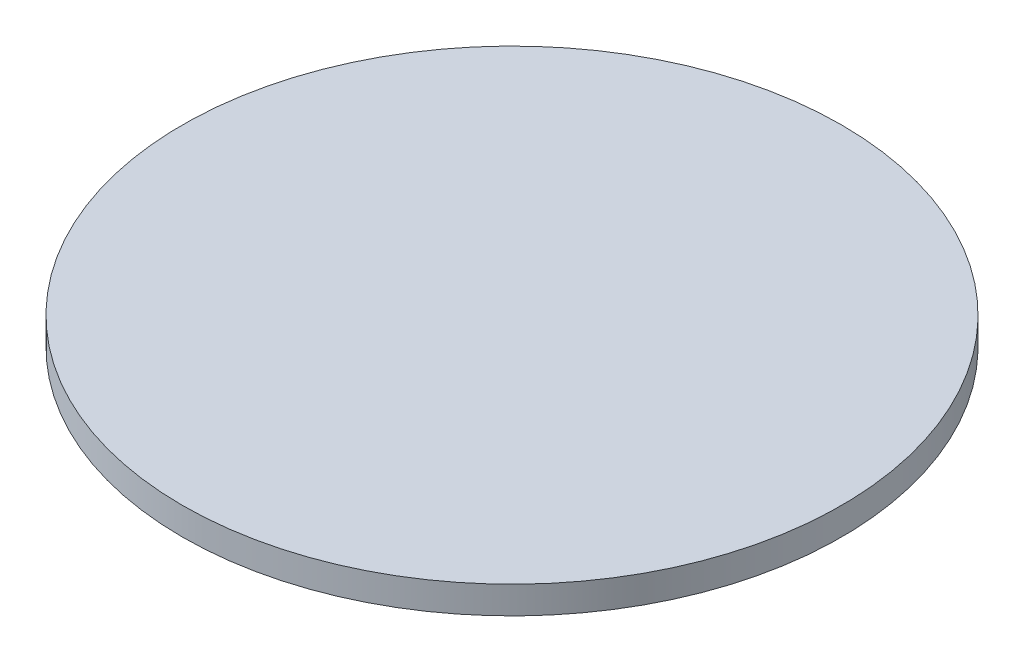
ISO-10303-21;
HEADER;
FILE_DESCRIPTION(('STEP AP214'),'2;1');
FILE_NAME('part.step','',(''),(''),'','','');
FILE_SCHEMA(('AUTOMOTIVE_DESIGN { 1 0 10303 214 1 1 1 1 }'));
ENDSEC;
DATA;
#1=APPLICATION_CONTEXT('core data for automotive mechanical design processes');
#2=APPLICATION_PROTOCOL_DEFINITION('international standard','automotive_design',2000,#1);
#3=PRODUCT_CONTEXT('',#1,'mechanical');
#4=PRODUCT('Part','Part','',(#3));
#5=PRODUCT_RELATED_PRODUCT_CATEGORY('part','',(#4));
#6=PRODUCT_DEFINITION_FORMATION('','',#4);
#7=PRODUCT_DEFINITION_CONTEXT('part definition',#1,'design');
#8=PRODUCT_DEFINITION('design','',#6,#7);
#9=PRODUCT_DEFINITION_SHAPE('','',#8);
#10=(LENGTH_UNIT() NAMED_UNIT(*) SI_UNIT(.MILLI.,.METRE.));
#11=(NAMED_UNIT(*) PLANE_ANGLE_UNIT() SI_UNIT($,.RADIAN.));
#12=(NAMED_UNIT(*) SI_UNIT($,.STERADIAN.) SOLID_ANGLE_UNIT());
#13=UNCERTAINTY_MEASURE_WITH_UNIT(LENGTH_MEASURE(1.E-05),#10,'distance_accuracy_value','');
#14=(GEOMETRIC_REPRESENTATION_CONTEXT(3) GLOBAL_UNCERTAINTY_ASSIGNED_CONTEXT((#13)) GLOBAL_UNIT_ASSIGNED_CONTEXT((#10,
#11,#12)) REPRESENTATION_CONTEXT('',''));
#15=CARTESIAN_POINT('',(0.,0.,0.));
#16=DIRECTION('',(0.,0.,1.));
#17=DIRECTION('',(1.,0.,0.));
#18=AXIS2_PLACEMENT_3D('',#15,#16,#17);
#19=CARTESIAN_POINT('',(0.,5.,0.));
#20=DIRECTION('',(0.,-1.,0.));
#21=DIRECTION('',(0.,0.,-1.));
#22=AXIS2_PLACEMENT_3D('',#19,#20,#21);
#23=CYLINDRICAL_SURFACE('',#22,60.);
#24=CARTESIAN_POINT('',(0.,5.,0.));
#25=DIRECTION('',(0.,1.,0.));
#26=DIRECTION('',(0.,0.,1.));
#27=AXIS2_PLACEMENT_3D('',#24,#25,#26);
#28=CIRCLE('',#27,60.);
#29=CARTESIAN_POINT('',(0.,5.,60.));
#30=VERTEX_POINT('',#29);
#31=EDGE_CURVE('E10',#30,#30,#28,.T.);
#32=ORIENTED_EDGE('',*,*,#31,.F.);
#33=EDGE_LOOP('',(#32));
#34=FACE_BOUND('',#33,.T.);
#35=CARTESIAN_POINT('',(0.,0.,0.));
#36=DIRECTION('',(0.,1.,0.));
#37=DIRECTION('',(0.,0.,1.));
#38=AXIS2_PLACEMENT_3D('',#35,#36,#37);
#39=CIRCLE('',#38,60.);
#40=CARTESIAN_POINT('',(0.,0.,60.));
#41=VERTEX_POINT('',#40);
#42=EDGE_CURVE('E37',#41,#41,#39,.T.);
#43=ORIENTED_EDGE('',*,*,#42,.T.);
#44=EDGE_LOOP('',(#43));
#45=FACE_BOUND('',#44,.T.);
#46=ADVANCED_FACE('F34',(#34,#45),#23,.T.);
#47=CARTESIAN_POINT('',(0.,5.,0.));
#48=DIRECTION('',(0.,1.,0.));
#49=DIRECTION('',(0.,0.,1.));
#50=AXIS2_PLACEMENT_3D('',#47,#48,#49);
#51=PLANE('',#50);
#52=ORIENTED_EDGE('',*,*,#31,.T.);
#53=EDGE_LOOP('',(#52));
#54=FACE_BOUND('',#53,.T.);
#55=ADVANCED_FACE('F49',(#54),#51,.T.);
#56=CARTESIAN_POINT('',(0.,0.,0.));
#57=DIRECTION('',(0.,1.,0.));
#58=DIRECTION('',(0.,0.,1.));
#59=AXIS2_PLACEMENT_3D('',#56,#57,#58);
#60=PLANE('',#59);
#61=ORIENTED_EDGE('',*,*,#42,.F.);
#62=EDGE_LOOP('',(#61));
#63=FACE_BOUND('',#62,.T.);
#64=ADVANCED_FACE('F47',(#63),#60,.F.);
#65=CLOSED_SHELL('',(#46,#55,#64));
#66=MANIFOLD_SOLID_BREP('B2',#65);
#67=ADVANCED_BREP_SHAPE_REPRESENTATION('',(#18,#66),#14);
#68=SHAPE_DEFINITION_REPRESENTATION(#9,#67);
ENDSEC;
END-ISO-10303-21;
